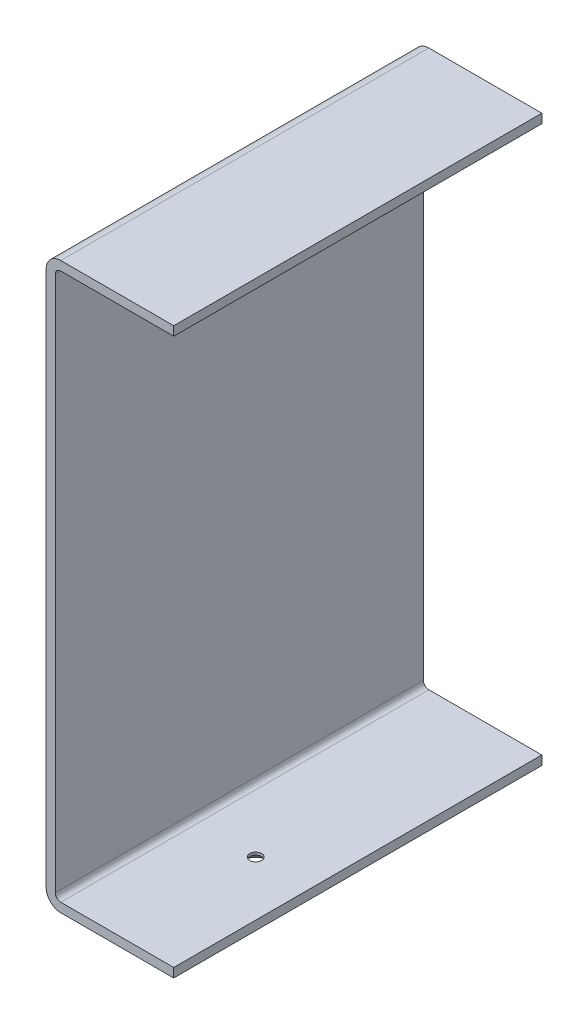
ISO-10303-21;
HEADER;
FILE_DESCRIPTION(('STEP AP214'),'2;1');
FILE_NAME('part.step','',(''),(''),'','','');
FILE_SCHEMA(('AUTOMOTIVE_DESIGN { 1 0 10303 214 1 1 1 1 }'));
ENDSEC;
DATA;
#1=APPLICATION_CONTEXT('core data for automotive mechanical design processes');
#2=APPLICATION_PROTOCOL_DEFINITION('international standard','automotive_design',2000,#1);
#3=PRODUCT_CONTEXT('',#1,'mechanical');
#4=PRODUCT('Part','Part','',(#3));
#5=PRODUCT_RELATED_PRODUCT_CATEGORY('part','',(#4));
#6=PRODUCT_DEFINITION_FORMATION('','',#4);
#7=PRODUCT_DEFINITION_CONTEXT('part definition',#1,'design');
#8=PRODUCT_DEFINITION('design','',#6,#7);
#9=PRODUCT_DEFINITION_SHAPE('','',#8);
#10=(LENGTH_UNIT() NAMED_UNIT(*) SI_UNIT(.MILLI.,.METRE.));
#11=(NAMED_UNIT(*) PLANE_ANGLE_UNIT() SI_UNIT($,.RADIAN.));
#12=(NAMED_UNIT(*) SI_UNIT($,.STERADIAN.) SOLID_ANGLE_UNIT());
#13=UNCERTAINTY_MEASURE_WITH_UNIT(LENGTH_MEASURE(1.E-05),#10,'distance_accuracy_value','');
#14=(GEOMETRIC_REPRESENTATION_CONTEXT(3) GLOBAL_UNCERTAINTY_ASSIGNED_CONTEXT((#13)) GLOBAL_UNIT_ASSIGNED_CONTEXT((#10,
#11,#12)) REPRESENTATION_CONTEXT('',''));
#15=CARTESIAN_POINT('',(0.,0.,0.));
#16=DIRECTION('',(0.,0.,1.));
#17=DIRECTION('',(1.,0.,0.));
#18=AXIS2_PLACEMENT_3D('',#15,#16,#17);
#19=CARTESIAN_POINT('',(70.,5.,202.));
#20=DIRECTION('',(-1.,0.,0.));
#21=DIRECTION('',(0.,0.,1.));
#22=AXIS2_PLACEMENT_3D('',#19,#20,#21);
#23=PLANE('',#22);
#24=DIRECTION('',(0.,1.,0.));
#25=VECTOR('',#24,1.);
#26=CARTESIAN_POINT('',(70.,5.,0.));
#27=LINE('',#26,#25);
#28=CARTESIAN_POINT('',(70.,0.,0.));
#29=VERTEX_POINT('',#28);
#30=CARTESIAN_POINT('',(70.,5.,0.));
#31=VERTEX_POINT('',#30);
#32=EDGE_CURVE('E162',#29,#31,#27,.T.);
#33=ORIENTED_EDGE('',*,*,#32,.T.);
#34=DIRECTION('',(0.,0.,-1.));
#35=VECTOR('',#34,1.);
#36=CARTESIAN_POINT('',(70.,5.,202.));
#37=LINE('',#36,#35);
#38=CARTESIAN_POINT('',(70.,5.,202.));
#39=VERTEX_POINT('',#38);
#40=EDGE_CURVE('E11',#39,#31,#37,.T.);
#41=ORIENTED_EDGE('',*,*,#40,.F.);
#42=DIRECTION('',(0.,1.,0.));
#43=VECTOR('',#42,1.);
#44=CARTESIAN_POINT('',(70.,5.,202.));
#45=LINE('',#44,#43);
#46=CARTESIAN_POINT('',(70.,0.,202.));
#47=VERTEX_POINT('',#46);
#48=EDGE_CURVE('E184',#47,#39,#45,.T.);
#49=ORIENTED_EDGE('',*,*,#48,.F.);
#50=DIRECTION('',(0.,0.,-1.));
#51=VECTOR('',#50,1.);
#52=CARTESIAN_POINT('',(70.,0.,202.));
#53=LINE('',#52,#51);
#54=EDGE_CURVE('E158',#47,#29,#53,.T.);
#55=ORIENTED_EDGE('',*,*,#54,.T.);
#56=EDGE_LOOP('',(#33,#41,#49,#55));
#57=FACE_BOUND('',#56,.T.);
#58=ADVANCED_FACE('F41',(#57),#23,.F.);
#59=CARTESIAN_POINT('',(70.,5.,202.));
#60=DIRECTION('',(0.,-1.,0.));
#61=DIRECTION('',(1.,0.,0.));
#62=AXIS2_PLACEMENT_3D('',#59,#60,#61);
#63=PLANE('',#62);
#64=CARTESIAN_POINT('',(40.,5.,127.));
#65=DIRECTION('',(0.,-1.,0.));
#66=DIRECTION('',(1.,0.,0.));
#67=AXIS2_PLACEMENT_3D('',#64,#65,#66);
#68=CIRCLE('',#67,3.29999999999996);
#69=CARTESIAN_POINT('',(43.3,5.,127.));
#70=VERTEX_POINT('',#69);
#71=EDGE_CURVE('E44',#70,#70,#68,.T.);
#72=ORIENTED_EDGE('',*,*,#71,.T.);
#73=EDGE_LOOP('',(#72));
#74=FACE_BOUND('',#73,.T.);
#75=DIRECTION('',(-1.,0.,0.));
#76=VECTOR('',#75,1.);
#77=CARTESIAN_POINT('',(70.,5.,0.));
#78=LINE('',#77,#76);
#79=CARTESIAN_POINT('',(8.00000000000001,5.,0.));
#80=VERTEX_POINT('',#79);
#81=EDGE_CURVE('E165',#31,#80,#78,.T.);
#82=ORIENTED_EDGE('',*,*,#81,.T.);
#83=DIRECTION('',(0.,0.,-1.));
#84=VECTOR('',#83,1.);
#85=CARTESIAN_POINT('',(8.00000000000001,5.,202.));
#86=LINE('',#85,#84);
#87=CARTESIAN_POINT('',(8.00000000000001,5.,202.));
#88=VERTEX_POINT('',#87);
#89=EDGE_CURVE('E50',#88,#80,#86,.T.);
#90=ORIENTED_EDGE('',*,*,#89,.F.);
#91=DIRECTION('',(-1.,0.,0.));
#92=VECTOR('',#91,1.);
#93=CARTESIAN_POINT('',(70.,5.,202.));
#94=LINE('',#93,#92);
#95=EDGE_CURVE('E113',#39,#88,#94,.T.);
#96=ORIENTED_EDGE('',*,*,#95,.F.);
#97=ORIENTED_EDGE('',*,*,#40,.T.);
#98=EDGE_LOOP('',(#82,#90,#96,#97));
#99=FACE_BOUND('',#98,.T.);
#100=ADVANCED_FACE('F267',(#74,#99),#63,.F.);
#101=CARTESIAN_POINT('',(8.,7.99999999999999,202.));
#102=DIRECTION('',(0.,0.,-1.));
#103=DIRECTION('',(-1.,0.,0.));
#104=AXIS2_PLACEMENT_3D('',#101,#102,#103);
#105=CYLINDRICAL_SURFACE('',#104,3.);
#106=CARTESIAN_POINT('',(8.,7.99999999999999,0.));
#107=DIRECTION('',(0.,0.,-1.));
#108=DIRECTION('',(-1.,0.,0.));
#109=AXIS2_PLACEMENT_3D('',#106,#107,#108);
#110=CIRCLE('',#109,3.);
#111=CARTESIAN_POINT('',(5.,7.99999999999999,0.));
#112=VERTEX_POINT('',#111);
#113=EDGE_CURVE('E167',#80,#112,#110,.T.);
#114=ORIENTED_EDGE('',*,*,#113,.T.);
#115=DIRECTION('',(0.,0.,-1.));
#116=VECTOR('',#115,1.);
#117=CARTESIAN_POINT('',(5.,7.99999999999999,202.));
#118=LINE('',#117,#116);
#119=CARTESIAN_POINT('',(5.,7.99999999999999,202.));
#120=VERTEX_POINT('',#119);
#121=EDGE_CURVE('E203',#120,#112,#118,.T.);
#122=ORIENTED_EDGE('',*,*,#121,.F.);
#123=CARTESIAN_POINT('',(8.,7.99999999999999,202.));
#124=DIRECTION('',(0.,0.,-1.));
#125=DIRECTION('',(-1.,0.,0.));
#126=AXIS2_PLACEMENT_3D('',#123,#124,#125);
#127=CIRCLE('',#126,3.);
#128=EDGE_CURVE('E212',#88,#120,#127,.T.);
#129=ORIENTED_EDGE('',*,*,#128,.F.);
#130=ORIENTED_EDGE('',*,*,#89,.T.);
#131=EDGE_LOOP('',(#114,#122,#129,#130));
#132=FACE_BOUND('',#131,.T.);
#133=ADVANCED_FACE('F210',(#132),#105,.F.);
#134=CARTESIAN_POINT('',(5.,7.99999999999999,202.));
#135=DIRECTION('',(-1.,0.,0.));
#136=DIRECTION('',(0.,0.,1.));
#137=AXIS2_PLACEMENT_3D('',#134,#135,#136);
#138=PLANE('',#137);
#139=DIRECTION('',(0.,1.,0.));
#140=VECTOR('',#139,1.);
#141=CARTESIAN_POINT('',(5.,7.99999999999999,0.));
#142=LINE('',#141,#140);
#143=CARTESIAN_POINT('',(5.,302.,0.));
#144=VERTEX_POINT('',#143);
#145=EDGE_CURVE('E169',#112,#144,#142,.T.);
#146=ORIENTED_EDGE('',*,*,#145,.T.);
#147=DIRECTION('',(0.,0.,-1.));
#148=VECTOR('',#147,1.);
#149=CARTESIAN_POINT('',(5.,302.,202.));
#150=LINE('',#149,#148);
#151=CARTESIAN_POINT('',(5.,302.,202.));
#152=VERTEX_POINT('',#151);
#153=EDGE_CURVE('E200',#152,#144,#150,.T.);
#154=ORIENTED_EDGE('',*,*,#153,.F.);
#155=DIRECTION('',(0.,1.,0.));
#156=VECTOR('',#155,1.);
#157=CARTESIAN_POINT('',(5.,7.99999999999999,202.));
#158=LINE('',#157,#156);
#159=EDGE_CURVE('E230',#120,#152,#158,.T.);
#160=ORIENTED_EDGE('',*,*,#159,.F.);
#161=ORIENTED_EDGE('',*,*,#121,.T.);
#162=EDGE_LOOP('',(#146,#154,#160,#161));
#163=FACE_BOUND('',#162,.T.);
#164=ADVANCED_FACE('F221',(#163),#138,.F.);
#165=CARTESIAN_POINT('',(8.,302.,202.));
#166=DIRECTION('',(0.,0.,-1.));
#167=DIRECTION('',(-1.,0.,0.));
#168=AXIS2_PLACEMENT_3D('',#165,#166,#167);
#169=CYLINDRICAL_SURFACE('',#168,3.);
#170=CARTESIAN_POINT('',(8.,302.,0.));
#171=DIRECTION('',(0.,0.,-1.));
#172=DIRECTION('',(-1.,0.,0.));
#173=AXIS2_PLACEMENT_3D('',#170,#171,#172);
#174=CIRCLE('',#173,3.);
#175=CARTESIAN_POINT('',(8.,305.,0.));
#176=VERTEX_POINT('',#175);
#177=EDGE_CURVE('E171',#144,#176,#174,.T.);
#178=ORIENTED_EDGE('',*,*,#177,.T.);
#179=DIRECTION('',(0.,0.,-1.));
#180=VECTOR('',#179,1.);
#181=CARTESIAN_POINT('',(8.,305.,202.));
#182=LINE('',#181,#180);
#183=CARTESIAN_POINT('',(8.,305.,202.));
#184=VERTEX_POINT('',#183);
#185=EDGE_CURVE('E197',#184,#176,#182,.T.);
#186=ORIENTED_EDGE('',*,*,#185,.F.);
#187=CARTESIAN_POINT('',(8.,302.,202.));
#188=DIRECTION('',(0.,0.,-1.));
#189=DIRECTION('',(-1.,0.,0.));
#190=AXIS2_PLACEMENT_3D('',#187,#188,#189);
#191=CIRCLE('',#190,3.);
#192=EDGE_CURVE('E227',#152,#184,#191,.T.);
#193=ORIENTED_EDGE('',*,*,#192,.F.);
#194=ORIENTED_EDGE('',*,*,#153,.T.);
#195=EDGE_LOOP('',(#178,#186,#193,#194));
#196=FACE_BOUND('',#195,.T.);
#197=ADVANCED_FACE('F225',(#196),#169,.F.);
#198=CARTESIAN_POINT('',(8.,305.,202.));
#199=DIRECTION('',(0.,1.,0.));
#200=DIRECTION('',(0.,0.,1.));
#201=AXIS2_PLACEMENT_3D('',#198,#199,#200);
#202=PLANE('',#201);
#203=DIRECTION('',(1.,0.,0.));
#204=VECTOR('',#203,1.);
#205=CARTESIAN_POINT('',(8.,305.,0.));
#206=LINE('',#205,#204);
#207=CARTESIAN_POINT('',(70.,305.,0.));
#208=VERTEX_POINT('',#207);
#209=EDGE_CURVE('E173',#176,#208,#206,.T.);
#210=ORIENTED_EDGE('',*,*,#209,.T.);
#211=DIRECTION('',(0.,0.,-1.));
#212=VECTOR('',#211,1.);
#213=CARTESIAN_POINT('',(70.,305.,202.));
#214=LINE('',#213,#212);
#215=CARTESIAN_POINT('',(70.,305.,202.));
#216=VERTEX_POINT('',#215);
#217=EDGE_CURVE('E194',#216,#208,#214,.T.);
#218=ORIENTED_EDGE('',*,*,#217,.F.);
#219=DIRECTION('',(1.,0.,0.));
#220=VECTOR('',#219,1.);
#221=CARTESIAN_POINT('',(8.,305.,202.));
#222=LINE('',#221,#220);
#223=EDGE_CURVE('E229',#184,#216,#222,.T.);
#224=ORIENTED_EDGE('',*,*,#223,.F.);
#225=ORIENTED_EDGE('',*,*,#185,.T.);
#226=EDGE_LOOP('',(#210,#218,#224,#225));
#227=FACE_BOUND('',#226,.T.);
#228=ADVANCED_FACE('F282',(#227),#202,.F.);
#229=CARTESIAN_POINT('',(70.,310.,202.));
#230=DIRECTION('',(-1.,0.,0.));
#231=DIRECTION('',(0.,0.,1.));
#232=AXIS2_PLACEMENT_3D('',#229,#230,#231);
#233=PLANE('',#232);
#234=DIRECTION('',(0.,1.,0.));
#235=VECTOR('',#234,1.);
#236=CARTESIAN_POINT('',(70.,310.,0.));
#237=LINE('',#236,#235);
#238=CARTESIAN_POINT('',(70.,310.,0.));
#239=VERTEX_POINT('',#238);
#240=EDGE_CURVE('E175',#208,#239,#237,.T.);
#241=ORIENTED_EDGE('',*,*,#240,.T.);
#242=DIRECTION('',(0.,0.,-1.));
#243=VECTOR('',#242,1.);
#244=CARTESIAN_POINT('',(70.,310.,202.));
#245=LINE('',#244,#243);
#246=CARTESIAN_POINT('',(70.,310.,202.));
#247=VERTEX_POINT('',#246);
#248=EDGE_CURVE('E191',#247,#239,#245,.T.);
#249=ORIENTED_EDGE('',*,*,#248,.F.);
#250=DIRECTION('',(0.,1.,0.));
#251=VECTOR('',#250,1.);
#252=CARTESIAN_POINT('',(70.,310.,202.));
#253=LINE('',#252,#251);
#254=EDGE_CURVE('E232',#216,#247,#253,.T.);
#255=ORIENTED_EDGE('',*,*,#254,.F.);
#256=ORIENTED_EDGE('',*,*,#217,.T.);
#257=EDGE_LOOP('',(#241,#249,#255,#256));
#258=FACE_BOUND('',#257,.T.);
#259=ADVANCED_FACE('F285',(#258),#233,.F.);
#260=CARTESIAN_POINT('',(8.,310.,202.));
#261=DIRECTION('',(0.,-1.,0.));
#262=DIRECTION('',(0.,0.,-1.));
#263=AXIS2_PLACEMENT_3D('',#260,#261,#262);
#264=PLANE('',#263);
#265=DIRECTION('',(-1.,0.,0.));
#266=VECTOR('',#265,1.);
#267=CARTESIAN_POINT('',(8.,310.,0.));
#268=LINE('',#267,#266);
#269=CARTESIAN_POINT('',(8.,310.,0.));
#270=VERTEX_POINT('',#269);
#271=EDGE_CURVE('E177',#239,#270,#268,.T.);
#272=ORIENTED_EDGE('',*,*,#271,.T.);
#273=DIRECTION('',(0.,0.,-1.));
#274=VECTOR('',#273,1.);
#275=CARTESIAN_POINT('',(8.,310.,202.));
#276=LINE('',#275,#274);
#277=CARTESIAN_POINT('',(8.,310.,202.));
#278=VERTEX_POINT('',#277);
#279=EDGE_CURVE('E188',#278,#270,#276,.T.);
#280=ORIENTED_EDGE('',*,*,#279,.F.);
#281=DIRECTION('',(-1.,0.,0.));
#282=VECTOR('',#281,1.);
#283=CARTESIAN_POINT('',(8.,310.,202.));
#284=LINE('',#283,#282);
#285=EDGE_CURVE('E238',#247,#278,#284,.T.);
#286=ORIENTED_EDGE('',*,*,#285,.F.);
#287=ORIENTED_EDGE('',*,*,#248,.T.);
#288=EDGE_LOOP('',(#272,#280,#286,#287));
#289=FACE_BOUND('',#288,.T.);
#290=ADVANCED_FACE('F244',(#289),#264,.F.);
#291=CARTESIAN_POINT('',(8.,302.,202.));
#292=DIRECTION('',(0.,0.,-1.));
#293=DIRECTION('',(-1.,0.,0.));
#294=AXIS2_PLACEMENT_3D('',#291,#292,#293);
#295=CYLINDRICAL_SURFACE('',#294,8.);
#296=CARTESIAN_POINT('',(8.,302.,0.));
#297=DIRECTION('',(0.,0.,1.));
#298=DIRECTION('',(-1.,0.,0.));
#299=AXIS2_PLACEMENT_3D('',#296,#297,#298);
#300=CIRCLE('',#299,8.);
#301=CARTESIAN_POINT('',(0.,302.,0.));
#302=VERTEX_POINT('',#301);
#303=EDGE_CURVE('E179',#270,#302,#300,.T.);
#304=ORIENTED_EDGE('',*,*,#303,.T.);
#305=DIRECTION('',(0.,0.,-1.));
#306=VECTOR('',#305,1.);
#307=CARTESIAN_POINT('',(0.,302.,202.));
#308=LINE('',#307,#306);
#309=CARTESIAN_POINT('',(0.,302.,202.));
#310=VERTEX_POINT('',#309);
#311=EDGE_CURVE('E153',#310,#302,#308,.T.);
#312=ORIENTED_EDGE('',*,*,#311,.F.);
#313=CARTESIAN_POINT('',(8.,302.,202.));
#314=DIRECTION('',(0.,0.,1.));
#315=DIRECTION('',(-1.,0.,0.));
#316=AXIS2_PLACEMENT_3D('',#313,#314,#315);
#317=CIRCLE('',#316,8.);
#318=EDGE_CURVE('E144',#278,#310,#317,.T.);
#319=ORIENTED_EDGE('',*,*,#318,.F.);
#320=ORIENTED_EDGE('',*,*,#279,.T.);
#321=EDGE_LOOP('',(#304,#312,#319,#320));
#322=FACE_BOUND('',#321,.T.);
#323=ADVANCED_FACE('F248',(#322),#295,.T.);
#324=CARTESIAN_POINT('',(0.,7.99999999999999,202.));
#325=DIRECTION('',(1.,0.,0.));
#326=DIRECTION('',(0.,1.,0.));
#327=AXIS2_PLACEMENT_3D('',#324,#325,#326);
#328=PLANE('',#327);
#329=DIRECTION('',(0.,-1.,0.));
#330=VECTOR('',#329,1.);
#331=CARTESIAN_POINT('',(0.,7.99999999999999,0.));
#332=LINE('',#331,#330);
#333=CARTESIAN_POINT('',(0.,7.99999999999999,0.));
#334=VERTEX_POINT('',#333);
#335=EDGE_CURVE('E152',#302,#334,#332,.T.);
#336=ORIENTED_EDGE('',*,*,#335,.T.);
#337=DIRECTION('',(0.,0.,-1.));
#338=VECTOR('',#337,1.);
#339=CARTESIAN_POINT('',(0.,7.99999999999999,202.));
#340=LINE('',#339,#338);
#341=CARTESIAN_POINT('',(0.,7.99999999999999,202.));
#342=VERTEX_POINT('',#341);
#343=EDGE_CURVE('E149',#342,#334,#340,.T.);
#344=ORIENTED_EDGE('',*,*,#343,.F.);
#345=DIRECTION('',(0.,-1.,0.));
#346=VECTOR('',#345,1.);
#347=CARTESIAN_POINT('',(0.,7.99999999999999,202.));
#348=LINE('',#347,#346);
#349=EDGE_CURVE('E138',#310,#342,#348,.T.);
#350=ORIENTED_EDGE('',*,*,#349,.F.);
#351=ORIENTED_EDGE('',*,*,#311,.T.);
#352=EDGE_LOOP('',(#336,#344,#350,#351));
#353=FACE_BOUND('',#352,.T.);
#354=ADVANCED_FACE('F150',(#353),#328,.F.);
#355=CARTESIAN_POINT('',(8.,7.99999999999999,202.));
#356=DIRECTION('',(0.,0.,-1.));
#357=DIRECTION('',(-1.,0.,0.));
#358=AXIS2_PLACEMENT_3D('',#355,#356,#357);
#359=CYLINDRICAL_SURFACE('',#358,8.);
#360=CARTESIAN_POINT('',(8.,7.99999999999999,0.));
#361=DIRECTION('',(0.,0.,1.));
#362=DIRECTION('',(-1.,0.,0.));
#363=AXIS2_PLACEMENT_3D('',#360,#361,#362);
#364=CIRCLE('',#363,8.);
#365=CARTESIAN_POINT('',(8.,0.,0.));
#366=VERTEX_POINT('',#365);
#367=EDGE_CURVE('E99',#334,#366,#364,.T.);
#368=ORIENTED_EDGE('',*,*,#367,.T.);
#369=DIRECTION('',(0.,0.,-1.));
#370=VECTOR('',#369,1.);
#371=CARTESIAN_POINT('',(8.,0.,202.));
#372=LINE('',#371,#370);
#373=CARTESIAN_POINT('',(8.,0.,202.));
#374=VERTEX_POINT('',#373);
#375=EDGE_CURVE('E154',#374,#366,#372,.T.);
#376=ORIENTED_EDGE('',*,*,#375,.F.);
#377=CARTESIAN_POINT('',(8.,7.99999999999999,202.));
#378=DIRECTION('',(0.,0.,1.));
#379=DIRECTION('',(-1.,0.,0.));
#380=AXIS2_PLACEMENT_3D('',#377,#378,#379);
#381=CIRCLE('',#380,8.);
#382=EDGE_CURVE('E142',#342,#374,#381,.T.);
#383=ORIENTED_EDGE('',*,*,#382,.F.);
#384=ORIENTED_EDGE('',*,*,#343,.T.);
#385=EDGE_LOOP('',(#368,#376,#383,#384));
#386=FACE_BOUND('',#385,.T.);
#387=ADVANCED_FACE('F156',(#386),#359,.T.);
#388=CARTESIAN_POINT('',(70.,0.,202.));
#389=DIRECTION('',(0.,1.,0.));
#390=DIRECTION('',(-1.,0.,0.));
#391=AXIS2_PLACEMENT_3D('',#388,#389,#390);
#392=PLANE('',#391);
#393=CARTESIAN_POINT('',(40.,0.,127.));
#394=DIRECTION('',(0.,-1.,0.));
#395=DIRECTION('',(0.,0.,-1.));
#396=AXIS2_PLACEMENT_3D('',#393,#394,#395);
#397=CIRCLE('',#396,6.855);
#398=CARTESIAN_POINT('',(40.,0.,120.145));
#399=VERTEX_POINT('',#398);
#400=EDGE_CURVE('E342',#399,#399,#397,.T.);
#401=ORIENTED_EDGE('',*,*,#400,.F.);
#402=EDGE_LOOP('',(#401));
#403=FACE_BOUND('',#402,.T.);
#404=DIRECTION('',(1.,0.,0.));
#405=VECTOR('',#404,1.);
#406=CARTESIAN_POINT('',(70.,0.,0.));
#407=LINE('',#406,#405);
#408=EDGE_CURVE('E105',#366,#29,#407,.T.);
#409=ORIENTED_EDGE('',*,*,#408,.T.);
#410=ORIENTED_EDGE('',*,*,#54,.F.);
#411=DIRECTION('',(1.,0.,0.));
#412=VECTOR('',#411,1.);
#413=CARTESIAN_POINT('',(70.,0.,202.));
#414=LINE('',#413,#412);
#415=EDGE_CURVE('E58',#374,#47,#414,.T.);
#416=ORIENTED_EDGE('',*,*,#415,.F.);
#417=ORIENTED_EDGE('',*,*,#375,.T.);
#418=EDGE_LOOP('',(#409,#410,#416,#417));
#419=FACE_BOUND('',#418,.T.);
#420=ADVANCED_FACE('F252',(#403,#419),#392,.F.);
#421=CARTESIAN_POINT('',(8.,7.99999999999999,202.));
#422=DIRECTION('',(0.,0.,-1.));
#423=DIRECTION('',(-1.,0.,0.));
#424=AXIS2_PLACEMENT_3D('',#421,#422,#423);
#425=PLANE('',#424);
#426=ORIENTED_EDGE('',*,*,#48,.T.);
#427=ORIENTED_EDGE('',*,*,#95,.T.);
#428=ORIENTED_EDGE('',*,*,#128,.T.);
#429=ORIENTED_EDGE('',*,*,#159,.T.);
#430=ORIENTED_EDGE('',*,*,#192,.T.);
#431=ORIENTED_EDGE('',*,*,#223,.T.);
#432=ORIENTED_EDGE('',*,*,#254,.T.);
#433=ORIENTED_EDGE('',*,*,#285,.T.);
#434=ORIENTED_EDGE('',*,*,#318,.T.);
#435=ORIENTED_EDGE('',*,*,#349,.T.);
#436=ORIENTED_EDGE('',*,*,#382,.T.);
#437=ORIENTED_EDGE('',*,*,#415,.T.);
#438=EDGE_LOOP('',(#426,#427,#428,#429,#430,#431,#432,#433,#434,#435,#436,#437));
#439=FACE_BOUND('',#438,.T.);
#440=ADVANCED_FACE('F140',(#439),#425,.F.);
#441=CARTESIAN_POINT('',(8.,7.99999999999999,0.));
#442=DIRECTION('',(0.,0.,-1.));
#443=DIRECTION('',(-1.,0.,0.));
#444=AXIS2_PLACEMENT_3D('',#441,#442,#443);
#445=PLANE('',#444);
#446=ORIENTED_EDGE('',*,*,#32,.F.);
#447=ORIENTED_EDGE('',*,*,#408,.F.);
#448=ORIENTED_EDGE('',*,*,#367,.F.);
#449=ORIENTED_EDGE('',*,*,#335,.F.);
#450=ORIENTED_EDGE('',*,*,#303,.F.);
#451=ORIENTED_EDGE('',*,*,#271,.F.);
#452=ORIENTED_EDGE('',*,*,#240,.F.);
#453=ORIENTED_EDGE('',*,*,#209,.F.);
#454=ORIENTED_EDGE('',*,*,#177,.F.);
#455=ORIENTED_EDGE('',*,*,#145,.F.);
#456=ORIENTED_EDGE('',*,*,#113,.F.);
#457=ORIENTED_EDGE('',*,*,#81,.F.);
#458=EDGE_LOOP('',(#446,#447,#448,#449,#450,#451,#452,#453,#454,#455,#456,#457));
#459=FACE_BOUND('',#458,.T.);
#460=ADVANCED_FACE('F216',(#459),#445,.T.);
#461=CARTESIAN_POINT('',(40.,0.,127.));
#462=DIRECTION('',(0.,-1.,0.));
#463=DIRECTION('',(0.,0.,-1.));
#464=AXIS2_PLACEMENT_3D('',#461,#462,#463);
#465=CYLINDRICAL_SURFACE('',#464,3.29999999999996);
#466=CARTESIAN_POINT('',(40.,3.55500000000004,127.));
#467=DIRECTION('',(0.,-1.,0.));
#468=DIRECTION('',(0.,0.,-1.));
#469=AXIS2_PLACEMENT_3D('',#466,#467,#468);
#470=CIRCLE('',#469,3.29999999999996);
#471=CARTESIAN_POINT('',(40.,3.55500000000004,123.7));
#472=VERTEX_POINT('',#471);
#473=EDGE_CURVE('E340',#472,#472,#470,.T.);
#474=ORIENTED_EDGE('',*,*,#473,.T.);
#475=EDGE_LOOP('',(#474));
#476=FACE_BOUND('',#475,.T.);
#477=ORIENTED_EDGE('',*,*,#71,.F.);
#478=EDGE_LOOP('',(#477));
#479=FACE_BOUND('',#478,.T.);
#480=ADVANCED_FACE('F314',(#476,#479),#465,.F.);
#481=CARTESIAN_POINT('',(40.,0.,127.));
#482=DIRECTION('',(0.,-1.,0.));
#483=DIRECTION('',(0.,0.,-1.));
#484=AXIS2_PLACEMENT_3D('',#481,#482,#483);
#485=CONICAL_SURFACE('',#484,6.855,0.785398163397449);
#486=ORIENTED_EDGE('',*,*,#473,.F.);
#487=EDGE_LOOP('',(#486));
#488=FACE_BOUND('',#487,.T.);
#489=ORIENTED_EDGE('',*,*,#400,.T.);
#490=EDGE_LOOP('',(#489));
#491=FACE_BOUND('',#490,.T.);
#492=ADVANCED_FACE('F324',(#488,#491),#485,.F.);
#493=CLOSED_SHELL('',(#58,#100,#133,#164,#197,#228,#259,#290,#323,#354,#387,#420,#440,#460,#480,#492));
#494=MANIFOLD_SOLID_BREP('B2',#493);
#495=ADVANCED_BREP_SHAPE_REPRESENTATION('',(#18,#494),#14);
#496=SHAPE_DEFINITION_REPRESENTATION(#9,#495);
ENDSEC;
END-ISO-10303-21;
